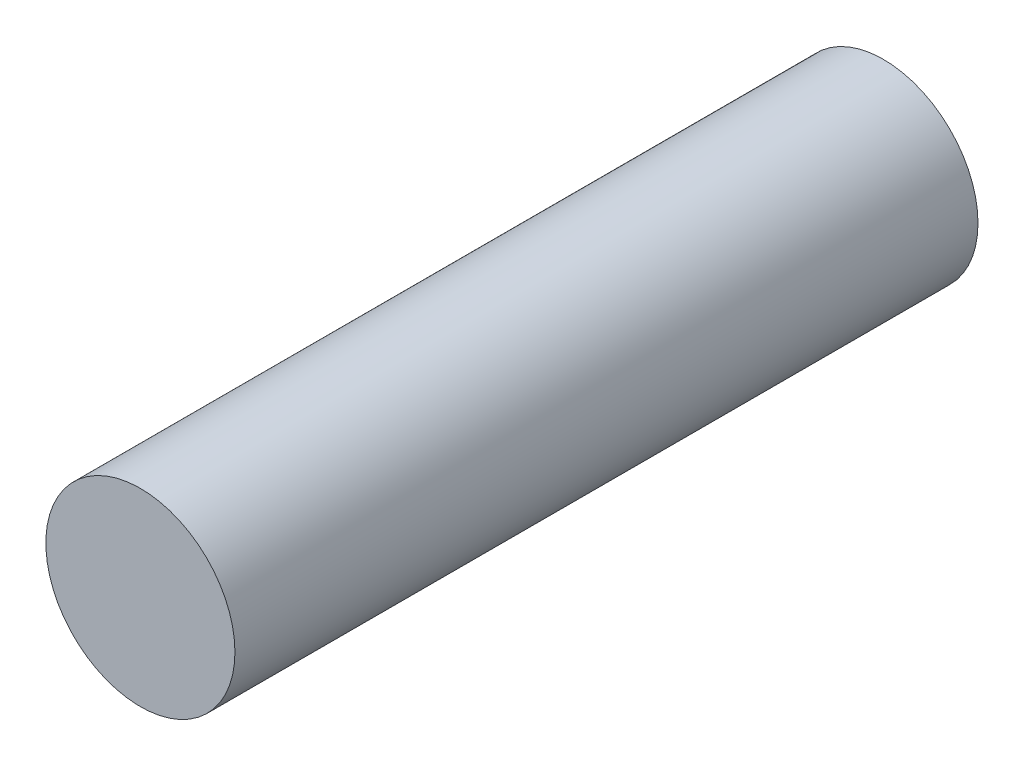
ISO-10303-21;
HEADER;
FILE_DESCRIPTION(('STEP AP214'),'2;1');
FILE_NAME('part.step','',(''),(''),'','','');
FILE_SCHEMA(('AUTOMOTIVE_DESIGN { 1 0 10303 214 1 1 1 1 }'));
ENDSEC;
DATA;
#1=APPLICATION_CONTEXT('core data for automotive mechanical design processes');
#2=APPLICATION_PROTOCOL_DEFINITION('international standard','automotive_design',2000,#1);
#3=PRODUCT_CONTEXT('',#1,'mechanical');
#4=PRODUCT('Part','Part','',(#3));
#5=PRODUCT_RELATED_PRODUCT_CATEGORY('part','',(#4));
#6=PRODUCT_DEFINITION_FORMATION('','',#4);
#7=PRODUCT_DEFINITION_CONTEXT('part definition',#1,'design');
#8=PRODUCT_DEFINITION('design','',#6,#7);
#9=PRODUCT_DEFINITION_SHAPE('','',#8);
#10=(LENGTH_UNIT() NAMED_UNIT(*) SI_UNIT(.MILLI.,.METRE.));
#11=(NAMED_UNIT(*) PLANE_ANGLE_UNIT() SI_UNIT($,.RADIAN.));
#12=(NAMED_UNIT(*) SI_UNIT($,.STERADIAN.) SOLID_ANGLE_UNIT());
#13=UNCERTAINTY_MEASURE_WITH_UNIT(LENGTH_MEASURE(1.E-05),#10,'distance_accuracy_value','');
#14=(GEOMETRIC_REPRESENTATION_CONTEXT(3) GLOBAL_UNCERTAINTY_ASSIGNED_CONTEXT((#13)) GLOBAL_UNIT_ASSIGNED_CONTEXT((#10,
#11,#12)) REPRESENTATION_CONTEXT('',''));
#15=CARTESIAN_POINT('',(0.,0.,0.));
#16=DIRECTION('',(0.,0.,1.));
#17=DIRECTION('',(1.,0.,0.));
#18=AXIS2_PLACEMENT_3D('',#15,#16,#17);
#19=CARTESIAN_POINT('',(0.,0.,5.50128321206491));
#20=DIRECTION('',(0.,0.,-1.));
#21=DIRECTION('',(-1.,0.,0.));
#22=AXIS2_PLACEMENT_3D('',#19,#20,#21);
#23=CYLINDRICAL_SURFACE('',#22,0.7);
#24=CARTESIAN_POINT('',(0.,0.,5.50128321206491));
#25=DIRECTION('',(0.,0.,1.));
#26=DIRECTION('',(1.,0.,0.));
#27=AXIS2_PLACEMENT_3D('',#24,#25,#26);
#28=CIRCLE('',#27,0.7);
#29=CARTESIAN_POINT('',(0.7,0.,5.50128321206491));
#30=VERTEX_POINT('',#29);
#31=EDGE_CURVE('E10',#30,#30,#28,.T.);
#32=ORIENTED_EDGE('',*,*,#31,.F.);
#33=EDGE_LOOP('',(#32));
#34=FACE_BOUND('',#33,.T.);
#35=CARTESIAN_POINT('',(0.,0.,0.));
#36=DIRECTION('',(0.,0.,1.));
#37=DIRECTION('',(1.,0.,0.));
#38=AXIS2_PLACEMENT_3D('',#35,#36,#37);
#39=CIRCLE('',#38,0.7);
#40=CARTESIAN_POINT('',(0.7,0.,0.));
#41=VERTEX_POINT('',#40);
#42=EDGE_CURVE('E42',#41,#41,#39,.T.);
#43=ORIENTED_EDGE('',*,*,#42,.T.);
#44=EDGE_LOOP('',(#43));
#45=FACE_BOUND('',#44,.T.);
#46=ADVANCED_FACE('F39',(#34,#45),#23,.T.);
#47=CARTESIAN_POINT('',(0.,0.,5.50128321206491));
#48=DIRECTION('',(0.,0.,1.));
#49=DIRECTION('',(1.,0.,0.));
#50=AXIS2_PLACEMENT_3D('',#47,#48,#49);
#51=PLANE('',#50);
#52=ORIENTED_EDGE('',*,*,#31,.T.);
#53=EDGE_LOOP('',(#52));
#54=FACE_BOUND('',#53,.T.);
#55=ADVANCED_FACE('F54',(#54),#51,.T.);
#56=CARTESIAN_POINT('',(0.,0.,0.));
#57=DIRECTION('',(0.,0.,1.));
#58=DIRECTION('',(1.,0.,0.));
#59=AXIS2_PLACEMENT_3D('',#56,#57,#58);
#60=PLANE('',#59);
#61=ORIENTED_EDGE('',*,*,#42,.F.);
#62=EDGE_LOOP('',(#61));
#63=FACE_BOUND('',#62,.T.);
#64=ADVANCED_FACE('F52',(#63),#60,.F.);
#65=CLOSED_SHELL('',(#46,#55,#64));
#66=MANIFOLD_SOLID_BREP('B2',#65);
#67=ADVANCED_BREP_SHAPE_REPRESENTATION('',(#18,#66),#14);
#68=SHAPE_DEFINITION_REPRESENTATION(#9,#67);
ENDSEC;
END-ISO-10303-21;
